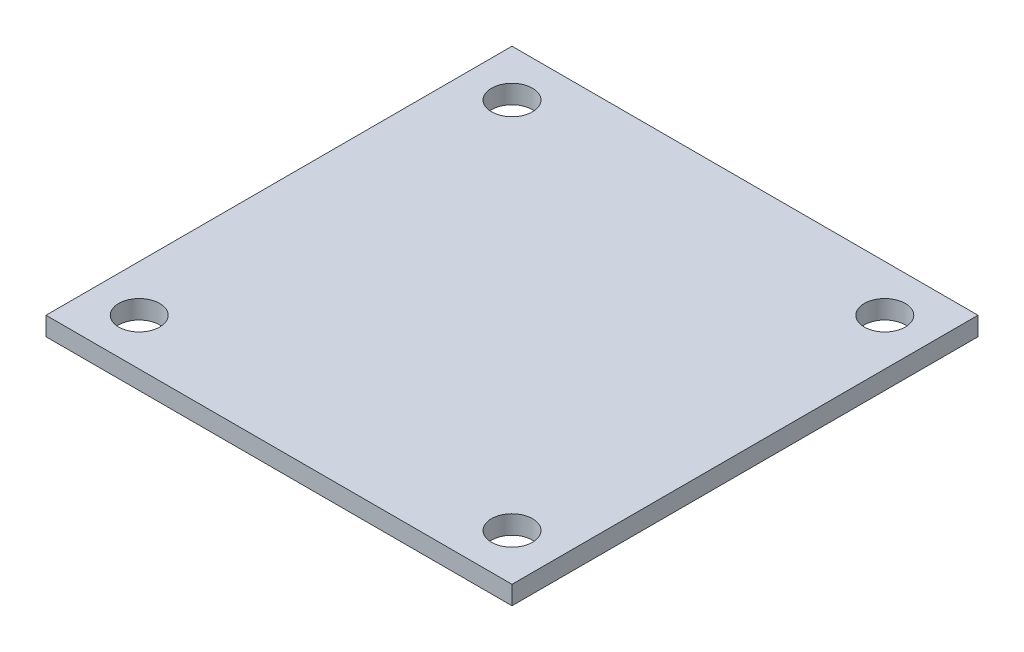
ISO-10303-21;
HEADER;
FILE_DESCRIPTION(('STEP AP214'),'2;1');
FILE_NAME('part.step','',(''),(''),'','','');
FILE_SCHEMA(('AUTOMOTIVE_DESIGN { 1 0 10303 214 1 1 1 1 }'));
ENDSEC;
DATA;
#1=APPLICATION_CONTEXT('core data for automotive mechanical design processes');
#2=APPLICATION_PROTOCOL_DEFINITION('international standard','automotive_design',2000,#1);
#3=PRODUCT_CONTEXT('',#1,'mechanical');
#4=PRODUCT('Part','Part','',(#3));
#5=PRODUCT_RELATED_PRODUCT_CATEGORY('part','',(#4));
#6=PRODUCT_DEFINITION_FORMATION('','',#4);
#7=PRODUCT_DEFINITION_CONTEXT('part definition',#1,'design');
#8=PRODUCT_DEFINITION('design','',#6,#7);
#9=PRODUCT_DEFINITION_SHAPE('','',#8);
#10=(LENGTH_UNIT() NAMED_UNIT(*) SI_UNIT(.MILLI.,.METRE.));
#11=(NAMED_UNIT(*) PLANE_ANGLE_UNIT() SI_UNIT($,.RADIAN.));
#12=(NAMED_UNIT(*) SI_UNIT($,.STERADIAN.) SOLID_ANGLE_UNIT());
#13=UNCERTAINTY_MEASURE_WITH_UNIT(LENGTH_MEASURE(1.E-05),#10,'distance_accuracy_value','');
#14=(GEOMETRIC_REPRESENTATION_CONTEXT(3) GLOBAL_UNCERTAINTY_ASSIGNED_CONTEXT((#13)) GLOBAL_UNIT_ASSIGNED_CONTEXT((#10,
#11,#12)) REPRESENTATION_CONTEXT('',''));
#15=CARTESIAN_POINT('',(0.,0.,0.));
#16=DIRECTION('',(0.,0.,1.));
#17=DIRECTION('',(1.,0.,0.));
#18=AXIS2_PLACEMENT_3D('',#15,#16,#17);
#19=CARTESIAN_POINT('',(0.,254.,3175.));
#20=DIRECTION('',(0.,0.,-1.));
#21=DIRECTION('',(-1.,0.,0.));
#22=AXIS2_PLACEMENT_3D('',#19,#20,#21);
#23=PLANE('',#22);
#24=DIRECTION('',(1.,0.,0.));
#25=VECTOR('',#24,1.);
#26=CARTESIAN_POINT('',(0.,0.,3175.));
#27=LINE('',#26,#25);
#28=CARTESIAN_POINT('',(-3175.,0.,3175.));
#29=VERTEX_POINT('',#28);
#30=CARTESIAN_POINT('',(3175.,0.,3175.));
#31=VERTEX_POINT('',#30);
#32=EDGE_CURVE('E113',#29,#31,#27,.T.);
#33=ORIENTED_EDGE('',*,*,#32,.T.);
#34=DIRECTION('',(0.,-1.,0.));
#35=VECTOR('',#34,1.);
#36=CARTESIAN_POINT('',(3175.,254.,3175.));
#37=LINE('',#36,#35);
#38=CARTESIAN_POINT('',(3175.,254.,3175.));
#39=VERTEX_POINT('',#38);
#40=EDGE_CURVE('E11',#39,#31,#37,.T.);
#41=ORIENTED_EDGE('',*,*,#40,.F.);
#42=DIRECTION('',(1.,0.,0.));
#43=VECTOR('',#42,1.);
#44=CARTESIAN_POINT('',(0.,254.,3175.));
#45=LINE('',#44,#43);
#46=CARTESIAN_POINT('',(-3175.,254.,3175.));
#47=VERTEX_POINT('',#46);
#48=EDGE_CURVE('E90',#47,#39,#45,.T.);
#49=ORIENTED_EDGE('',*,*,#48,.F.);
#50=DIRECTION('',(0.,-1.,0.));
#51=VECTOR('',#50,1.);
#52=CARTESIAN_POINT('',(-3175.,254.,3175.));
#53=LINE('',#52,#51);
#54=EDGE_CURVE('E57',#47,#29,#53,.T.);
#55=ORIENTED_EDGE('',*,*,#54,.T.);
#56=EDGE_LOOP('',(#33,#41,#49,#55));
#57=FACE_BOUND('',#56,.T.);
#58=ADVANCED_FACE('F39',(#57),#23,.F.);
#59=CARTESIAN_POINT('',(3175.,254.,0.));
#60=DIRECTION('',(-1.,0.,0.));
#61=DIRECTION('',(0.,0.,1.));
#62=AXIS2_PLACEMENT_3D('',#59,#60,#61);
#63=PLANE('',#62);
#64=DIRECTION('',(0.,0.,-1.));
#65=VECTOR('',#64,1.);
#66=CARTESIAN_POINT('',(3175.,0.,0.));
#67=LINE('',#66,#65);
#68=CARTESIAN_POINT('',(3175.,0.,-3175.));
#69=VERTEX_POINT('',#68);
#70=EDGE_CURVE('E94',#31,#69,#67,.T.);
#71=ORIENTED_EDGE('',*,*,#70,.T.);
#72=DIRECTION('',(0.,-1.,0.));
#73=VECTOR('',#72,1.);
#74=CARTESIAN_POINT('',(3175.,254.,-3175.));
#75=LINE('',#74,#73);
#76=CARTESIAN_POINT('',(3175.,254.,-3175.));
#77=VERTEX_POINT('',#76);
#78=EDGE_CURVE('E48',#77,#69,#75,.T.);
#79=ORIENTED_EDGE('',*,*,#78,.F.);
#80=DIRECTION('',(0.,0.,-1.));
#81=VECTOR('',#80,1.);
#82=CARTESIAN_POINT('',(3175.,254.,0.));
#83=LINE('',#82,#81);
#84=EDGE_CURVE('E82',#39,#77,#83,.T.);
#85=ORIENTED_EDGE('',*,*,#84,.F.);
#86=ORIENTED_EDGE('',*,*,#40,.T.);
#87=EDGE_LOOP('',(#71,#79,#85,#86));
#88=FACE_BOUND('',#87,.T.);
#89=ADVANCED_FACE('F91',(#88),#63,.F.);
#90=CARTESIAN_POINT('',(0.,254.,-3175.));
#91=DIRECTION('',(0.,0.,-1.));
#92=DIRECTION('',(-1.,0.,0.));
#93=AXIS2_PLACEMENT_3D('',#90,#91,#92);
#94=PLANE('',#93);
#95=DIRECTION('',(1.,0.,0.));
#96=VECTOR('',#95,1.);
#97=CARTESIAN_POINT('',(0.,0.,-3175.));
#98=LINE('',#97,#96);
#99=CARTESIAN_POINT('',(-3175.,0.,-3175.));
#100=VERTEX_POINT('',#99);
#101=EDGE_CURVE('E119',#100,#69,#98,.T.);
#102=ORIENTED_EDGE('',*,*,#101,.F.);
#103=DIRECTION('',(0.,-1.,0.));
#104=VECTOR('',#103,1.);
#105=CARTESIAN_POINT('',(-3175.,254.,-3175.));
#106=LINE('',#105,#104);
#107=CARTESIAN_POINT('',(-3175.,254.,-3175.));
#108=VERTEX_POINT('',#107);
#109=EDGE_CURVE('E66',#108,#100,#106,.T.);
#110=ORIENTED_EDGE('',*,*,#109,.F.);
#111=DIRECTION('',(1.,0.,0.));
#112=VECTOR('',#111,1.);
#113=CARTESIAN_POINT('',(0.,254.,-3175.));
#114=LINE('',#113,#112);
#115=EDGE_CURVE('E86',#108,#77,#114,.T.);
#116=ORIENTED_EDGE('',*,*,#115,.T.);
#117=ORIENTED_EDGE('',*,*,#78,.T.);
#118=EDGE_LOOP('',(#102,#110,#116,#117));
#119=FACE_BOUND('',#118,.T.);
#120=ADVANCED_FACE('F100',(#119),#94,.T.);
#121=CARTESIAN_POINT('',(-2540.,254.,2540.));
#122=DIRECTION('',(0.,-1.,0.));
#123=DIRECTION('',(0.,0.,-1.));
#124=AXIS2_PLACEMENT_3D('',#121,#122,#123);
#125=CYLINDRICAL_SURFACE('',#124,279.4);
#126=CARTESIAN_POINT('',(-2540.,254.,2540.));
#127=DIRECTION('',(0.,1.,0.));
#128=DIRECTION('',(0.,0.,1.));
#129=AXIS2_PLACEMENT_3D('',#126,#127,#128);
#130=CIRCLE('',#129,279.4);
#131=CARTESIAN_POINT('',(-2540.,254.,2819.4));
#132=VERTEX_POINT('',#131);
#133=EDGE_CURVE('E140',#132,#132,#130,.T.);
#134=ORIENTED_EDGE('',*,*,#133,.T.);
#135=EDGE_LOOP('',(#134));
#136=FACE_BOUND('',#135,.T.);
#137=CARTESIAN_POINT('',(-2540.,0.,2540.));
#138=DIRECTION('',(0.,1.,0.));
#139=DIRECTION('',(0.,0.,1.));
#140=AXIS2_PLACEMENT_3D('',#137,#138,#139);
#141=CIRCLE('',#140,279.4);
#142=CARTESIAN_POINT('',(-2540.,0.,2819.4));
#143=VERTEX_POINT('',#142);
#144=EDGE_CURVE('E115',#143,#143,#141,.T.);
#145=ORIENTED_EDGE('',*,*,#144,.F.);
#146=EDGE_LOOP('',(#145));
#147=FACE_BOUND('',#146,.T.);
#148=ADVANCED_FACE('F143',(#136,#147),#125,.F.);
#149=CARTESIAN_POINT('',(-2540.,254.,-2540.));
#150=DIRECTION('',(0.,-1.,0.));
#151=DIRECTION('',(0.,0.,-1.));
#152=AXIS2_PLACEMENT_3D('',#149,#150,#151);
#153=CYLINDRICAL_SURFACE('',#152,279.400000000001);
#154=CARTESIAN_POINT('',(-2540.,254.,-2540.));
#155=DIRECTION('',(0.,1.,0.));
#156=DIRECTION('',(0.,0.,1.));
#157=AXIS2_PLACEMENT_3D('',#154,#155,#156);
#158=CIRCLE('',#157,279.400000000001);
#159=CARTESIAN_POINT('',(-2540.,254.,-2260.6));
#160=VERTEX_POINT('',#159);
#161=EDGE_CURVE('E135',#160,#160,#158,.T.);
#162=ORIENTED_EDGE('',*,*,#161,.T.);
#163=EDGE_LOOP('',(#162));
#164=FACE_BOUND('',#163,.T.);
#165=CARTESIAN_POINT('',(-2540.,0.,-2540.));
#166=DIRECTION('',(0.,1.,0.));
#167=DIRECTION('',(0.,0.,1.));
#168=AXIS2_PLACEMENT_3D('',#165,#166,#167);
#169=CIRCLE('',#168,279.400000000001);
#170=CARTESIAN_POINT('',(-2540.,0.,-2260.6));
#171=VERTEX_POINT('',#170);
#172=EDGE_CURVE('E108',#171,#171,#169,.T.);
#173=ORIENTED_EDGE('',*,*,#172,.F.);
#174=EDGE_LOOP('',(#173));
#175=FACE_BOUND('',#174,.T.);
#176=ADVANCED_FACE('F170',(#164,#175),#153,.F.);
#177=CARTESIAN_POINT('',(2540.,254.,2540.));
#178=DIRECTION('',(0.,-1.,0.));
#179=DIRECTION('',(0.,0.,-1.));
#180=AXIS2_PLACEMENT_3D('',#177,#178,#179);
#181=CYLINDRICAL_SURFACE('',#180,279.400000000001);
#182=CARTESIAN_POINT('',(2540.,254.,2540.));
#183=DIRECTION('',(0.,1.,0.));
#184=DIRECTION('',(0.,0.,1.));
#185=AXIS2_PLACEMENT_3D('',#182,#183,#184);
#186=CIRCLE('',#185,279.400000000001);
#187=CARTESIAN_POINT('',(2540.,254.,2819.4));
#188=VERTEX_POINT('',#187);
#189=EDGE_CURVE('E130',#188,#188,#186,.T.);
#190=ORIENTED_EDGE('',*,*,#189,.T.);
#191=EDGE_LOOP('',(#190));
#192=FACE_BOUND('',#191,.T.);
#193=CARTESIAN_POINT('',(2540.,0.,2540.));
#194=DIRECTION('',(0.,1.,0.));
#195=DIRECTION('',(0.,0.,1.));
#196=AXIS2_PLACEMENT_3D('',#193,#194,#195);
#197=CIRCLE('',#196,279.400000000001);
#198=CARTESIAN_POINT('',(2540.,0.,2819.4));
#199=VERTEX_POINT('',#198);
#200=EDGE_CURVE('E106',#199,#199,#197,.T.);
#201=ORIENTED_EDGE('',*,*,#200,.F.);
#202=EDGE_LOOP('',(#201));
#203=FACE_BOUND('',#202,.T.);
#204=ADVANCED_FACE('F166',(#192,#203),#181,.F.);
#205=CARTESIAN_POINT('',(2540.,254.,-2540.));
#206=DIRECTION('',(0.,-1.,0.));
#207=DIRECTION('',(0.,0.,-1.));
#208=AXIS2_PLACEMENT_3D('',#205,#206,#207);
#209=CYLINDRICAL_SURFACE('',#208,279.400000000001);
#210=CARTESIAN_POINT('',(2540.,254.,-2540.));
#211=DIRECTION('',(0.,1.,0.));
#212=DIRECTION('',(0.,0.,1.));
#213=AXIS2_PLACEMENT_3D('',#210,#211,#212);
#214=CIRCLE('',#213,279.400000000001);
#215=CARTESIAN_POINT('',(2540.,254.,-2260.6));
#216=VERTEX_POINT('',#215);
#217=EDGE_CURVE('E123',#216,#216,#214,.T.);
#218=ORIENTED_EDGE('',*,*,#217,.T.);
#219=EDGE_LOOP('',(#218));
#220=FACE_BOUND('',#219,.T.);
#221=CARTESIAN_POINT('',(2540.,0.,-2540.));
#222=DIRECTION('',(0.,1.,0.));
#223=DIRECTION('',(0.,0.,1.));
#224=AXIS2_PLACEMENT_3D('',#221,#222,#223);
#225=CIRCLE('',#224,279.400000000001);
#226=CARTESIAN_POINT('',(2540.,0.,-2260.6));
#227=VERTEX_POINT('',#226);
#228=EDGE_CURVE('E103',#227,#227,#225,.T.);
#229=ORIENTED_EDGE('',*,*,#228,.F.);
#230=EDGE_LOOP('',(#229));
#231=FACE_BOUND('',#230,.T.);
#232=ADVANCED_FACE('F41',(#220,#231),#209,.F.);
#233=CARTESIAN_POINT('',(-3175.,254.,0.));
#234=DIRECTION('',(-1.,0.,0.));
#235=DIRECTION('',(0.,0.,1.));
#236=AXIS2_PLACEMENT_3D('',#233,#234,#235);
#237=PLANE('',#236);
#238=DIRECTION('',(0.,0.,-1.));
#239=VECTOR('',#238,1.);
#240=CARTESIAN_POINT('',(-3175.,0.,0.));
#241=LINE('',#240,#239);
#242=EDGE_CURVE('E118',#29,#100,#241,.T.);
#243=ORIENTED_EDGE('',*,*,#242,.F.);
#244=ORIENTED_EDGE('',*,*,#54,.F.);
#245=DIRECTION('',(0.,0.,-1.));
#246=VECTOR('',#245,1.);
#247=CARTESIAN_POINT('',(-3175.,254.,0.));
#248=LINE('',#247,#246);
#249=EDGE_CURVE('E98',#47,#108,#248,.T.);
#250=ORIENTED_EDGE('',*,*,#249,.T.);
#251=ORIENTED_EDGE('',*,*,#109,.T.);
#252=EDGE_LOOP('',(#243,#244,#250,#251));
#253=FACE_BOUND('',#252,.T.);
#254=ADVANCED_FACE('F148',(#253),#237,.T.);
#255=CARTESIAN_POINT('',(0.,254.,0.));
#256=DIRECTION('',(0.,1.,0.));
#257=DIRECTION('',(0.,0.,1.));
#258=AXIS2_PLACEMENT_3D('',#255,#256,#257);
#259=PLANE('',#258);
#260=ORIENTED_EDGE('',*,*,#217,.F.);
#261=EDGE_LOOP('',(#260));
#262=FACE_BOUND('',#261,.T.);
#263=ORIENTED_EDGE('',*,*,#189,.F.);
#264=EDGE_LOOP('',(#263));
#265=FACE_BOUND('',#264,.T.);
#266=ORIENTED_EDGE('',*,*,#161,.F.);
#267=EDGE_LOOP('',(#266));
#268=FACE_BOUND('',#267,.T.);
#269=ORIENTED_EDGE('',*,*,#133,.F.);
#270=EDGE_LOOP('',(#269));
#271=FACE_BOUND('',#270,.T.);
#272=ORIENTED_EDGE('',*,*,#48,.T.);
#273=ORIENTED_EDGE('',*,*,#84,.T.);
#274=ORIENTED_EDGE('',*,*,#115,.F.);
#275=ORIENTED_EDGE('',*,*,#249,.F.);
#276=EDGE_LOOP('',(#272,#273,#274,#275));
#277=FACE_BOUND('',#276,.T.);
#278=ADVANCED_FACE('F81',(#262,#265,#268,#271,#277),#259,.T.);
#279=CARTESIAN_POINT('',(0.,0.,0.));
#280=DIRECTION('',(0.,1.,0.));
#281=DIRECTION('',(0.,0.,1.));
#282=AXIS2_PLACEMENT_3D('',#279,#280,#281);
#283=PLANE('',#282);
#284=ORIENTED_EDGE('',*,*,#228,.T.);
#285=EDGE_LOOP('',(#284));
#286=FACE_BOUND('',#285,.T.);
#287=ORIENTED_EDGE('',*,*,#200,.T.);
#288=EDGE_LOOP('',(#287));
#289=FACE_BOUND('',#288,.T.);
#290=ORIENTED_EDGE('',*,*,#172,.T.);
#291=EDGE_LOOP('',(#290));
#292=FACE_BOUND('',#291,.T.);
#293=ORIENTED_EDGE('',*,*,#144,.T.);
#294=EDGE_LOOP('',(#293));
#295=FACE_BOUND('',#294,.T.);
#296=ORIENTED_EDGE('',*,*,#32,.F.);
#297=ORIENTED_EDGE('',*,*,#242,.T.);
#298=ORIENTED_EDGE('',*,*,#101,.T.);
#299=ORIENTED_EDGE('',*,*,#70,.F.);
#300=EDGE_LOOP('',(#296,#297,#298,#299));
#301=FACE_BOUND('',#300,.T.);
#302=ADVANCED_FACE('F144',(#286,#289,#292,#295,#301),#283,.F.);
#303=CLOSED_SHELL('',(#58,#89,#120,#148,#176,#204,#232,#254,#278,#302));
#304=MANIFOLD_SOLID_BREP('B2',#303);
#305=ADVANCED_BREP_SHAPE_REPRESENTATION('',(#18,#304),#14);
#306=SHAPE_DEFINITION_REPRESENTATION(#9,#305);
ENDSEC;
END-ISO-10303-21;
